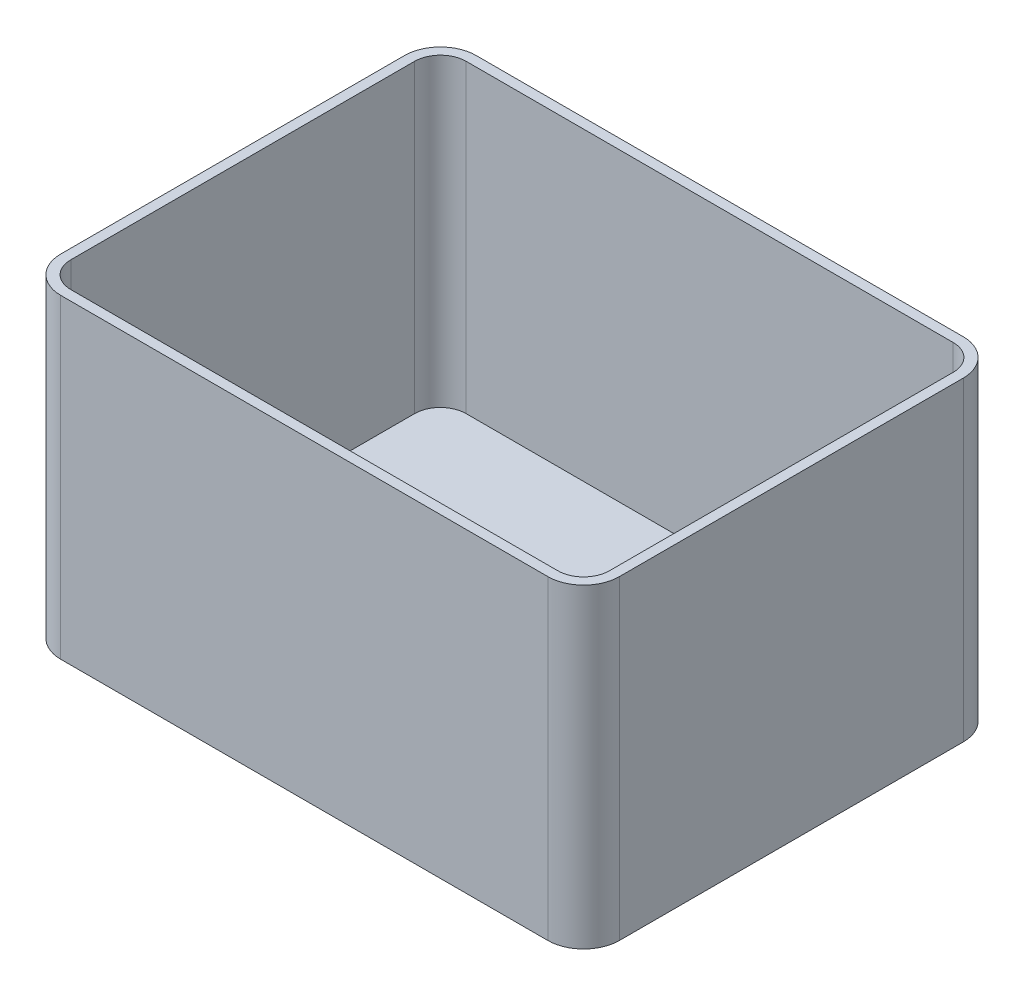
ISO-10303-21;
HEADER;
FILE_DESCRIPTION(('STEP AP214'),'2;1');
FILE_NAME('part.step','',(''),(''),'','','');
FILE_SCHEMA(('AUTOMOTIVE_DESIGN { 1 0 10303 214 1 1 1 1 }'));
ENDSEC;
DATA;
#1=APPLICATION_CONTEXT('core data for automotive mechanical design processes');
#2=APPLICATION_PROTOCOL_DEFINITION('international standard','automotive_design',2000,#1);
#3=PRODUCT_CONTEXT('',#1,'mechanical');
#4=PRODUCT('Part','Part','',(#3));
#5=PRODUCT_RELATED_PRODUCT_CATEGORY('part','',(#4));
#6=PRODUCT_DEFINITION_FORMATION('','',#4);
#7=PRODUCT_DEFINITION_CONTEXT('part definition',#1,'design');
#8=PRODUCT_DEFINITION('design','',#6,#7);
#9=PRODUCT_DEFINITION_SHAPE('','',#8);
#10=(LENGTH_UNIT() NAMED_UNIT(*) SI_UNIT(.MILLI.,.METRE.));
#11=(NAMED_UNIT(*) PLANE_ANGLE_UNIT() SI_UNIT($,.RADIAN.));
#12=(NAMED_UNIT(*) SI_UNIT($,.STERADIAN.) SOLID_ANGLE_UNIT());
#13=UNCERTAINTY_MEASURE_WITH_UNIT(LENGTH_MEASURE(1.E-05),#10,'distance_accuracy_value','');
#14=(GEOMETRIC_REPRESENTATION_CONTEXT(3) GLOBAL_UNCERTAINTY_ASSIGNED_CONTEXT((#13)) GLOBAL_UNIT_ASSIGNED_CONTEXT((#10,
#11,#12)) REPRESENTATION_CONTEXT('',''));
#15=CARTESIAN_POINT('',(0.,0.,0.));
#16=DIRECTION('',(0.,0.,1.));
#17=DIRECTION('',(1.,0.,0.));
#18=AXIS2_PLACEMENT_3D('',#15,#16,#17);
#19=CARTESIAN_POINT('',(170.,220.,-120.));
#20=DIRECTION('',(0.,-1.,0.));
#21=DIRECTION('',(0.,0.,-1.));
#22=AXIS2_PLACEMENT_3D('',#19,#20,#21);
#23=PLANE('',#22);
#24=CARTESIAN_POINT('',(170.,220.,-120.));
#25=DIRECTION('',(0.,1.,0.));
#26=DIRECTION('',(0.,0.,-1.));
#27=AXIS2_PLACEMENT_3D('',#24,#25,#26);
#28=CIRCLE('',#27,25.);
#29=CARTESIAN_POINT('',(195.,220.,-120.));
#30=VERTEX_POINT('',#29);
#31=CARTESIAN_POINT('',(170.,220.,-145.));
#32=VERTEX_POINT('',#31);
#33=EDGE_CURVE('E161',#30,#32,#28,.T.);
#34=ORIENTED_EDGE('',*,*,#33,.T.);
#35=DIRECTION('',(-1.,0.,0.));
#36=VECTOR('',#35,1.);
#37=CARTESIAN_POINT('',(-170.,220.,-145.));
#38=LINE('',#37,#36);
#39=CARTESIAN_POINT('',(-170.,220.,-145.));
#40=VERTEX_POINT('',#39);
#41=EDGE_CURVE('E102',#32,#40,#38,.T.);
#42=ORIENTED_EDGE('',*,*,#41,.T.);
#43=CARTESIAN_POINT('',(-170.,220.,-120.));
#44=DIRECTION('',(0.,1.,0.));
#45=DIRECTION('',(0.,0.,-1.));
#46=AXIS2_PLACEMENT_3D('',#43,#44,#45);
#47=CIRCLE('',#46,25.);
#48=CARTESIAN_POINT('',(-195.,220.,-120.));
#49=VERTEX_POINT('',#48);
#50=EDGE_CURVE('E176',#40,#49,#47,.T.);
#51=ORIENTED_EDGE('',*,*,#50,.T.);
#52=DIRECTION('',(0.,0.,1.));
#53=VECTOR('',#52,1.);
#54=CARTESIAN_POINT('',(-195.,220.,120.));
#55=LINE('',#54,#53);
#56=CARTESIAN_POINT('',(-195.,220.,120.));
#57=VERTEX_POINT('',#56);
#58=EDGE_CURVE('E188',#49,#57,#55,.T.);
#59=ORIENTED_EDGE('',*,*,#58,.T.);
#60=CARTESIAN_POINT('',(-170.,220.,120.));
#61=DIRECTION('',(0.,1.,0.));
#62=DIRECTION('',(0.,0.,-1.));
#63=AXIS2_PLACEMENT_3D('',#60,#61,#62);
#64=CIRCLE('',#63,25.);
#65=CARTESIAN_POINT('',(-170.,220.,145.));
#66=VERTEX_POINT('',#65);
#67=EDGE_CURVE('E124',#57,#66,#64,.T.);
#68=ORIENTED_EDGE('',*,*,#67,.T.);
#69=DIRECTION('',(1.,0.,0.));
#70=VECTOR('',#69,1.);
#71=CARTESIAN_POINT('',(-170.,220.,145.));
#72=LINE('',#71,#70);
#73=CARTESIAN_POINT('',(170.,220.,145.));
#74=VERTEX_POINT('',#73);
#75=EDGE_CURVE('E117',#66,#74,#72,.T.);
#76=ORIENTED_EDGE('',*,*,#75,.T.);
#77=CARTESIAN_POINT('',(170.,220.,120.));
#78=DIRECTION('',(0.,1.,0.));
#79=DIRECTION('',(0.,0.,1.));
#80=AXIS2_PLACEMENT_3D('',#77,#78,#79);
#81=CIRCLE('',#80,25.);
#82=CARTESIAN_POINT('',(195.,220.,120.));
#83=VERTEX_POINT('',#82);
#84=EDGE_CURVE('E121',#74,#83,#81,.T.);
#85=ORIENTED_EDGE('',*,*,#84,.T.);
#86=DIRECTION('',(0.,0.,-1.));
#87=VECTOR('',#86,1.);
#88=CARTESIAN_POINT('',(195.,220.,120.));
#89=LINE('',#88,#87);
#90=EDGE_CURVE('E61',#83,#30,#89,.T.);
#91=ORIENTED_EDGE('',*,*,#90,.T.);
#92=EDGE_LOOP('',(#34,#42,#51,#59,#68,#76,#85,#91));
#93=FACE_BOUND('',#92,.T.);
#94=CARTESIAN_POINT('',(170.,220.,-120.));
#95=DIRECTION('',(0.,-1.,0.));
#96=DIRECTION('',(0.,0.,-1.));
#97=AXIS2_PLACEMENT_3D('',#94,#95,#96);
#98=CIRCLE('',#97,18.);
#99=CARTESIAN_POINT('',(188.,220.,-120.));
#100=VERTEX_POINT('',#99);
#101=CARTESIAN_POINT('',(170.,220.,-138.));
#102=VERTEX_POINT('',#101);
#103=EDGE_CURVE('E214',#100,#102,#98,.F.);
#104=ORIENTED_EDGE('',*,*,#103,.F.);
#105=DIRECTION('',(0.,0.,-1.));
#106=VECTOR('',#105,1.);
#107=CARTESIAN_POINT('',(188.,220.,-120.));
#108=LINE('',#107,#106);
#109=CARTESIAN_POINT('',(188.,220.,120.));
#110=VERTEX_POINT('',#109);
#111=EDGE_CURVE('E194',#110,#100,#108,.T.);
#112=ORIENTED_EDGE('',*,*,#111,.F.);
#113=CARTESIAN_POINT('',(170.,220.,120.));
#114=DIRECTION('',(0.,-1.,0.));
#115=DIRECTION('',(0.,0.,-1.));
#116=AXIS2_PLACEMENT_3D('',#113,#114,#115);
#117=CIRCLE('',#116,18.);
#118=CARTESIAN_POINT('',(170.,220.,138.));
#119=VERTEX_POINT('',#118);
#120=EDGE_CURVE('E197',#119,#110,#117,.F.);
#121=ORIENTED_EDGE('',*,*,#120,.F.);
#122=DIRECTION('',(1.,0.,0.));
#123=VECTOR('',#122,1.);
#124=CARTESIAN_POINT('',(170.,220.,138.));
#125=LINE('',#124,#123);
#126=CARTESIAN_POINT('',(-170.,220.,138.));
#127=VERTEX_POINT('',#126);
#128=EDGE_CURVE('E199',#127,#119,#125,.T.);
#129=ORIENTED_EDGE('',*,*,#128,.F.);
#130=CARTESIAN_POINT('',(-170.,220.,120.));
#131=DIRECTION('',(0.,-1.,0.));
#132=DIRECTION('',(0.,0.,-1.));
#133=AXIS2_PLACEMENT_3D('',#130,#131,#132);
#134=CIRCLE('',#133,18.);
#135=CARTESIAN_POINT('',(-188.,220.,120.));
#136=VERTEX_POINT('',#135);
#137=EDGE_CURVE('E202',#136,#127,#134,.F.);
#138=ORIENTED_EDGE('',*,*,#137,.F.);
#139=DIRECTION('',(0.,0.,1.));
#140=VECTOR('',#139,1.);
#141=CARTESIAN_POINT('',(-188.,220.,-120.));
#142=LINE('',#141,#140);
#143=CARTESIAN_POINT('',(-188.,220.,-120.));
#144=VERTEX_POINT('',#143);
#145=EDGE_CURVE('E205',#144,#136,#142,.T.);
#146=ORIENTED_EDGE('',*,*,#145,.F.);
#147=CARTESIAN_POINT('',(-170.,220.,-120.));
#148=DIRECTION('',(0.,-1.,0.));
#149=DIRECTION('',(0.,0.,-1.));
#150=AXIS2_PLACEMENT_3D('',#147,#148,#149);
#151=CIRCLE('',#150,18.);
#152=CARTESIAN_POINT('',(-170.,220.,-138.));
#153=VERTEX_POINT('',#152);
#154=EDGE_CURVE('E208',#153,#144,#151,.F.);
#155=ORIENTED_EDGE('',*,*,#154,.F.);
#156=DIRECTION('',(-1.,0.,0.));
#157=VECTOR('',#156,1.);
#158=CARTESIAN_POINT('',(170.,220.,-138.));
#159=LINE('',#158,#157);
#160=EDGE_CURVE('E211',#102,#153,#159,.T.);
#161=ORIENTED_EDGE('',*,*,#160,.F.);
#162=EDGE_LOOP('',(#104,#112,#121,#129,#138,#146,#155,#161));
#163=FACE_BOUND('',#162,.T.);
#164=ADVANCED_FACE('F37',(#93,#163),#23,.F.);
#165=CARTESIAN_POINT('',(170.,220.,-120.));
#166=DIRECTION('',(0.,-1.,0.));
#167=DIRECTION('',(0.,0.,-1.));
#168=AXIS2_PLACEMENT_3D('',#165,#166,#167);
#169=CYLINDRICAL_SURFACE('',#168,25.);
#170=CARTESIAN_POINT('',(170.,0.,-120.));
#171=DIRECTION('',(0.,1.,0.));
#172=DIRECTION('',(0.,0.,-1.));
#173=AXIS2_PLACEMENT_3D('',#170,#171,#172);
#174=CIRCLE('',#173,25.);
#175=CARTESIAN_POINT('',(195.,0.,-120.));
#176=VERTEX_POINT('',#175);
#177=CARTESIAN_POINT('',(170.,0.,-145.));
#178=VERTEX_POINT('',#177);
#179=EDGE_CURVE('E145',#176,#178,#174,.T.);
#180=ORIENTED_EDGE('',*,*,#179,.T.);
#181=DIRECTION('',(0.,-1.,0.));
#182=VECTOR('',#181,1.);
#183=CARTESIAN_POINT('',(170.,220.,-145.));
#184=LINE('',#183,#182);
#185=EDGE_CURVE('E11',#32,#178,#184,.T.);
#186=ORIENTED_EDGE('',*,*,#185,.F.);
#187=ORIENTED_EDGE('',*,*,#33,.F.);
#188=DIRECTION('',(0.,-1.,0.));
#189=VECTOR('',#188,1.);
#190=CARTESIAN_POINT('',(195.,220.,-120.));
#191=LINE('',#190,#189);
#192=EDGE_CURVE('E141',#30,#176,#191,.T.);
#193=ORIENTED_EDGE('',*,*,#192,.T.);
#194=EDGE_LOOP('',(#180,#186,#187,#193));
#195=FACE_BOUND('',#194,.T.);
#196=ADVANCED_FACE('F39',(#195),#169,.T.);
#197=CARTESIAN_POINT('',(-170.,220.,-145.));
#198=DIRECTION('',(0.,0.,1.));
#199=DIRECTION('',(1.,0.,0.));
#200=AXIS2_PLACEMENT_3D('',#197,#198,#199);
#201=PLANE('',#200);
#202=DIRECTION('',(-1.,0.,0.));
#203=VECTOR('',#202,1.);
#204=CARTESIAN_POINT('',(-170.,0.,-145.));
#205=LINE('',#204,#203);
#206=CARTESIAN_POINT('',(-170.,0.,-145.));
#207=VERTEX_POINT('',#206);
#208=EDGE_CURVE('E148',#178,#207,#205,.T.);
#209=ORIENTED_EDGE('',*,*,#208,.T.);
#210=DIRECTION('',(0.,-1.,0.));
#211=VECTOR('',#210,1.);
#212=CARTESIAN_POINT('',(-170.,220.,-145.));
#213=LINE('',#212,#211);
#214=EDGE_CURVE('E45',#40,#207,#213,.T.);
#215=ORIENTED_EDGE('',*,*,#214,.F.);
#216=ORIENTED_EDGE('',*,*,#41,.F.);
#217=ORIENTED_EDGE('',*,*,#185,.T.);
#218=EDGE_LOOP('',(#209,#215,#216,#217));
#219=FACE_BOUND('',#218,.T.);
#220=ADVANCED_FACE('F333',(#219),#201,.F.);
#221=CARTESIAN_POINT('',(-170.,220.,-120.));
#222=DIRECTION('',(0.,-1.,0.));
#223=DIRECTION('',(0.,0.,-1.));
#224=AXIS2_PLACEMENT_3D('',#221,#222,#223);
#225=CYLINDRICAL_SURFACE('',#224,25.);
#226=CARTESIAN_POINT('',(-170.,0.,-120.));
#227=DIRECTION('',(0.,1.,0.));
#228=DIRECTION('',(0.,0.,-1.));
#229=AXIS2_PLACEMENT_3D('',#226,#227,#228);
#230=CIRCLE('',#229,25.);
#231=CARTESIAN_POINT('',(-195.,0.,-120.));
#232=VERTEX_POINT('',#231);
#233=EDGE_CURVE('E151',#207,#232,#230,.T.);
#234=ORIENTED_EDGE('',*,*,#233,.T.);
#235=DIRECTION('',(0.,-1.,0.));
#236=VECTOR('',#235,1.);
#237=CARTESIAN_POINT('',(-195.,220.,-120.));
#238=LINE('',#237,#236);
#239=EDGE_CURVE('E168',#49,#232,#238,.T.);
#240=ORIENTED_EDGE('',*,*,#239,.F.);
#241=ORIENTED_EDGE('',*,*,#50,.F.);
#242=ORIENTED_EDGE('',*,*,#214,.T.);
#243=EDGE_LOOP('',(#234,#240,#241,#242));
#244=FACE_BOUND('',#243,.T.);
#245=ADVANCED_FACE('F174',(#244),#225,.T.);
#246=CARTESIAN_POINT('',(-195.,220.,120.));
#247=DIRECTION('',(1.,0.,0.));
#248=DIRECTION('',(0.,0.,-1.));
#249=AXIS2_PLACEMENT_3D('',#246,#247,#248);
#250=PLANE('',#249);
#251=DIRECTION('',(0.,0.,1.));
#252=VECTOR('',#251,1.);
#253=CARTESIAN_POINT('',(-195.,0.,120.));
#254=LINE('',#253,#252);
#255=CARTESIAN_POINT('',(-195.,0.,120.));
#256=VERTEX_POINT('',#255);
#257=EDGE_CURVE('E153',#232,#256,#254,.T.);
#258=ORIENTED_EDGE('',*,*,#257,.T.);
#259=DIRECTION('',(0.,-1.,0.));
#260=VECTOR('',#259,1.);
#261=CARTESIAN_POINT('',(-195.,220.,120.));
#262=LINE('',#261,#260);
#263=EDGE_CURVE('E165',#57,#256,#262,.T.);
#264=ORIENTED_EDGE('',*,*,#263,.F.);
#265=ORIENTED_EDGE('',*,*,#58,.F.);
#266=ORIENTED_EDGE('',*,*,#239,.T.);
#267=EDGE_LOOP('',(#258,#264,#265,#266));
#268=FACE_BOUND('',#267,.T.);
#269=ADVANCED_FACE('F184',(#268),#250,.F.);
#270=CARTESIAN_POINT('',(-170.,220.,120.));
#271=DIRECTION('',(0.,-1.,0.));
#272=DIRECTION('',(0.,0.,-1.));
#273=AXIS2_PLACEMENT_3D('',#270,#271,#272);
#274=CYLINDRICAL_SURFACE('',#273,25.);
#275=CARTESIAN_POINT('',(-170.,0.,120.));
#276=DIRECTION('',(0.,1.,0.));
#277=DIRECTION('',(0.,0.,-1.));
#278=AXIS2_PLACEMENT_3D('',#275,#276,#277);
#279=CIRCLE('',#278,25.);
#280=CARTESIAN_POINT('',(-170.,0.,145.));
#281=VERTEX_POINT('',#280);
#282=EDGE_CURVE('E155',#256,#281,#279,.T.);
#283=ORIENTED_EDGE('',*,*,#282,.T.);
#284=DIRECTION('',(0.,-1.,0.));
#285=VECTOR('',#284,1.);
#286=CARTESIAN_POINT('',(-170.,220.,145.));
#287=LINE('',#286,#285);
#288=EDGE_CURVE('E136',#66,#281,#287,.T.);
#289=ORIENTED_EDGE('',*,*,#288,.F.);
#290=ORIENTED_EDGE('',*,*,#67,.F.);
#291=ORIENTED_EDGE('',*,*,#263,.T.);
#292=EDGE_LOOP('',(#283,#289,#290,#291));
#293=FACE_BOUND('',#292,.T.);
#294=ADVANCED_FACE('F187',(#293),#274,.T.);
#295=CARTESIAN_POINT('',(-170.,220.,145.));
#296=DIRECTION('',(0.,0.,-1.));
#297=DIRECTION('',(-1.,0.,0.));
#298=AXIS2_PLACEMENT_3D('',#295,#296,#297);
#299=PLANE('',#298);
#300=DIRECTION('',(1.,0.,0.));
#301=VECTOR('',#300,1.);
#302=CARTESIAN_POINT('',(-170.,0.,145.));
#303=LINE('',#302,#301);
#304=CARTESIAN_POINT('',(170.,0.,145.));
#305=VERTEX_POINT('',#304);
#306=EDGE_CURVE('E133',#281,#305,#303,.T.);
#307=ORIENTED_EDGE('',*,*,#306,.T.);
#308=DIRECTION('',(0.,-1.,0.));
#309=VECTOR('',#308,1.);
#310=CARTESIAN_POINT('',(170.,220.,145.));
#311=LINE('',#310,#309);
#312=EDGE_CURVE('E130',#74,#305,#311,.T.);
#313=ORIENTED_EDGE('',*,*,#312,.F.);
#314=ORIENTED_EDGE('',*,*,#75,.F.);
#315=ORIENTED_EDGE('',*,*,#288,.T.);
#316=EDGE_LOOP('',(#307,#313,#314,#315));
#317=FACE_BOUND('',#316,.T.);
#318=ADVANCED_FACE('F131',(#317),#299,.F.);
#319=CARTESIAN_POINT('',(170.,220.,120.));
#320=DIRECTION('',(0.,-1.,0.));
#321=DIRECTION('',(0.,0.,-1.));
#322=AXIS2_PLACEMENT_3D('',#319,#320,#321);
#323=CYLINDRICAL_SURFACE('',#322,25.);
#324=CARTESIAN_POINT('',(170.,0.,120.));
#325=DIRECTION('',(0.,1.,0.));
#326=DIRECTION('',(0.,0.,1.));
#327=AXIS2_PLACEMENT_3D('',#324,#325,#326);
#328=CIRCLE('',#327,25.);
#329=CARTESIAN_POINT('',(195.,0.,120.));
#330=VERTEX_POINT('',#329);
#331=EDGE_CURVE('E158',#305,#330,#328,.T.);
#332=ORIENTED_EDGE('',*,*,#331,.T.);
#333=DIRECTION('',(0.,-1.,0.));
#334=VECTOR('',#333,1.);
#335=CARTESIAN_POINT('',(195.,220.,120.));
#336=LINE('',#335,#334);
#337=EDGE_CURVE('E137',#83,#330,#336,.T.);
#338=ORIENTED_EDGE('',*,*,#337,.F.);
#339=ORIENTED_EDGE('',*,*,#84,.F.);
#340=ORIENTED_EDGE('',*,*,#312,.T.);
#341=EDGE_LOOP('',(#332,#338,#339,#340));
#342=FACE_BOUND('',#341,.T.);
#343=ADVANCED_FACE('F139',(#342),#323,.T.);
#344=CARTESIAN_POINT('',(195.,220.,120.));
#345=DIRECTION('',(-1.,0.,0.));
#346=DIRECTION('',(0.,0.,1.));
#347=AXIS2_PLACEMENT_3D('',#344,#345,#346);
#348=PLANE('',#347);
#349=DIRECTION('',(0.,0.,-1.));
#350=VECTOR('',#349,1.);
#351=CARTESIAN_POINT('',(195.,0.,120.));
#352=LINE('',#351,#350);
#353=EDGE_CURVE('E94',#330,#176,#352,.T.);
#354=ORIENTED_EDGE('',*,*,#353,.T.);
#355=ORIENTED_EDGE('',*,*,#192,.F.);
#356=ORIENTED_EDGE('',*,*,#90,.F.);
#357=ORIENTED_EDGE('',*,*,#337,.T.);
#358=EDGE_LOOP('',(#354,#355,#356,#357));
#359=FACE_BOUND('',#358,.T.);
#360=ADVANCED_FACE('F339',(#359),#348,.F.);
#361=CARTESIAN_POINT('',(170.,0.,-120.));
#362=DIRECTION('',(0.,-1.,0.));
#363=DIRECTION('',(0.,0.,-1.));
#364=AXIS2_PLACEMENT_3D('',#361,#362,#363);
#365=PLANE('',#364);
#366=ORIENTED_EDGE('',*,*,#179,.F.);
#367=ORIENTED_EDGE('',*,*,#353,.F.);
#368=ORIENTED_EDGE('',*,*,#331,.F.);
#369=ORIENTED_EDGE('',*,*,#306,.F.);
#370=ORIENTED_EDGE('',*,*,#282,.F.);
#371=ORIENTED_EDGE('',*,*,#257,.F.);
#372=ORIENTED_EDGE('',*,*,#233,.F.);
#373=ORIENTED_EDGE('',*,*,#208,.F.);
#374=EDGE_LOOP('',(#366,#367,#368,#369,#370,#371,#372,#373));
#375=FACE_BOUND('',#374,.T.);
#376=ADVANCED_FACE('F180',(#375),#365,.T.);
#377=CARTESIAN_POINT('',(170.,220.,-120.));
#378=DIRECTION('',(0.,-1.,0.));
#379=DIRECTION('',(0.,0.,-1.));
#380=AXIS2_PLACEMENT_3D('',#377,#378,#379);
#381=CYLINDRICAL_SURFACE('',#380,18.);
#382=CARTESIAN_POINT('',(170.,7.00000000000001,-120.));
#383=DIRECTION('',(0.,-1.,0.));
#384=DIRECTION('',(0.,0.,-1.));
#385=AXIS2_PLACEMENT_3D('',#382,#383,#384);
#386=CIRCLE('',#385,18.);
#387=CARTESIAN_POINT('',(188.,7.00000000000001,-120.));
#388=VERTEX_POINT('',#387);
#389=CARTESIAN_POINT('',(170.,7.00000000000001,-138.));
#390=VERTEX_POINT('',#389);
#391=EDGE_CURVE('E254',#388,#390,#386,.F.);
#392=ORIENTED_EDGE('',*,*,#391,.F.);
#393=DIRECTION('',(0.,-1.,0.));
#394=VECTOR('',#393,1.);
#395=CARTESIAN_POINT('',(188.,220.,-120.));
#396=LINE('',#395,#394);
#397=EDGE_CURVE('E196',#100,#388,#396,.T.);
#398=ORIENTED_EDGE('',*,*,#397,.F.);
#399=ORIENTED_EDGE('',*,*,#103,.T.);
#400=DIRECTION('',(0.,1.,0.));
#401=VECTOR('',#400,1.);
#402=CARTESIAN_POINT('',(170.,220.,-138.));
#403=LINE('',#402,#401);
#404=EDGE_CURVE('E149',#102,#390,#403,.F.);
#405=ORIENTED_EDGE('',*,*,#404,.T.);
#406=EDGE_LOOP('',(#392,#398,#399,#405));
#407=FACE_BOUND('',#406,.T.);
#408=ADVANCED_FACE('F270',(#407),#381,.F.);
#409=CARTESIAN_POINT('',(-170.,220.,-138.));
#410=DIRECTION('',(0.,0.,1.));
#411=DIRECTION('',(1.,0.,0.));
#412=AXIS2_PLACEMENT_3D('',#409,#410,#411);
#413=PLANE('',#412);
#414=DIRECTION('',(-1.,0.,0.));
#415=VECTOR('',#414,1.);
#416=CARTESIAN_POINT('',(170.,7.,-138.));
#417=LINE('',#416,#415);
#418=CARTESIAN_POINT('',(-170.,7.00000000000001,-138.));
#419=VERTEX_POINT('',#418);
#420=EDGE_CURVE('E249',#390,#419,#417,.T.);
#421=ORIENTED_EDGE('',*,*,#420,.F.);
#422=ORIENTED_EDGE('',*,*,#404,.F.);
#423=ORIENTED_EDGE('',*,*,#160,.T.);
#424=DIRECTION('',(0.,-1.,0.));
#425=VECTOR('',#424,1.);
#426=CARTESIAN_POINT('',(-170.,220.,-138.));
#427=LINE('',#426,#425);
#428=EDGE_CURVE('E246',#153,#419,#427,.T.);
#429=ORIENTED_EDGE('',*,*,#428,.T.);
#430=EDGE_LOOP('',(#421,#422,#423,#429));
#431=FACE_BOUND('',#430,.T.);
#432=ADVANCED_FACE('F299',(#431),#413,.T.);
#433=CARTESIAN_POINT('',(-170.,220.,-120.));
#434=DIRECTION('',(0.,-1.,0.));
#435=DIRECTION('',(0.,0.,-1.));
#436=AXIS2_PLACEMENT_3D('',#433,#434,#435);
#437=CYLINDRICAL_SURFACE('',#436,18.);
#438=CARTESIAN_POINT('',(-170.,7.00000000000001,-120.));
#439=DIRECTION('',(0.,-1.,0.));
#440=DIRECTION('',(0.,0.,-1.));
#441=AXIS2_PLACEMENT_3D('',#438,#439,#440);
#442=CIRCLE('',#441,18.);
#443=CARTESIAN_POINT('',(-188.,7.00000000000001,-120.));
#444=VERTEX_POINT('',#443);
#445=EDGE_CURVE('E243',#419,#444,#442,.F.);
#446=ORIENTED_EDGE('',*,*,#445,.F.);
#447=ORIENTED_EDGE('',*,*,#428,.F.);
#448=ORIENTED_EDGE('',*,*,#154,.T.);
#449=DIRECTION('',(0.,1.,0.));
#450=VECTOR('',#449,1.);
#451=CARTESIAN_POINT('',(-188.,220.,-120.));
#452=LINE('',#451,#450);
#453=EDGE_CURVE('E240',#144,#444,#452,.F.);
#454=ORIENTED_EDGE('',*,*,#453,.T.);
#455=EDGE_LOOP('',(#446,#447,#448,#454));
#456=FACE_BOUND('',#455,.T.);
#457=ADVANCED_FACE('F305',(#456),#437,.F.);
#458=CARTESIAN_POINT('',(-188.,220.,120.));
#459=DIRECTION('',(1.,0.,0.));
#460=DIRECTION('',(0.,0.,-1.));
#461=AXIS2_PLACEMENT_3D('',#458,#459,#460);
#462=PLANE('',#461);
#463=DIRECTION('',(0.,0.,1.));
#464=VECTOR('',#463,1.);
#465=CARTESIAN_POINT('',(-188.,7.,-120.));
#466=LINE('',#465,#464);
#467=CARTESIAN_POINT('',(-188.,7.00000000000001,120.));
#468=VERTEX_POINT('',#467);
#469=EDGE_CURVE('E237',#444,#468,#466,.T.);
#470=ORIENTED_EDGE('',*,*,#469,.F.);
#471=ORIENTED_EDGE('',*,*,#453,.F.);
#472=ORIENTED_EDGE('',*,*,#145,.T.);
#473=DIRECTION('',(0.,-1.,0.));
#474=VECTOR('',#473,1.);
#475=CARTESIAN_POINT('',(-188.,220.,120.));
#476=LINE('',#475,#474);
#477=EDGE_CURVE('E234',#136,#468,#476,.T.);
#478=ORIENTED_EDGE('',*,*,#477,.T.);
#479=EDGE_LOOP('',(#470,#471,#472,#478));
#480=FACE_BOUND('',#479,.T.);
#481=ADVANCED_FACE('F404',(#480),#462,.T.);
#482=CARTESIAN_POINT('',(-170.,220.,120.));
#483=DIRECTION('',(0.,-1.,0.));
#484=DIRECTION('',(0.,0.,-1.));
#485=AXIS2_PLACEMENT_3D('',#482,#483,#484);
#486=CYLINDRICAL_SURFACE('',#485,18.);
#487=CARTESIAN_POINT('',(-170.,7.00000000000001,120.));
#488=DIRECTION('',(0.,-1.,0.));
#489=DIRECTION('',(0.,0.,-1.));
#490=AXIS2_PLACEMENT_3D('',#487,#488,#489);
#491=CIRCLE('',#490,18.);
#492=CARTESIAN_POINT('',(-170.,7.00000000000001,138.));
#493=VERTEX_POINT('',#492);
#494=EDGE_CURVE('E231',#468,#493,#491,.F.);
#495=ORIENTED_EDGE('',*,*,#494,.F.);
#496=ORIENTED_EDGE('',*,*,#477,.F.);
#497=ORIENTED_EDGE('',*,*,#137,.T.);
#498=DIRECTION('',(0.,1.,0.));
#499=VECTOR('',#498,1.);
#500=CARTESIAN_POINT('',(-170.,220.,138.));
#501=LINE('',#500,#499);
#502=EDGE_CURVE('E228',#127,#493,#501,.F.);
#503=ORIENTED_EDGE('',*,*,#502,.T.);
#504=EDGE_LOOP('',(#495,#496,#497,#503));
#505=FACE_BOUND('',#504,.T.);
#506=ADVANCED_FACE('F326',(#505),#486,.F.);
#507=CARTESIAN_POINT('',(-170.,220.,138.));
#508=DIRECTION('',(0.,0.,-1.));
#509=DIRECTION('',(-1.,0.,0.));
#510=AXIS2_PLACEMENT_3D('',#507,#508,#509);
#511=PLANE('',#510);
#512=DIRECTION('',(1.,0.,0.));
#513=VECTOR('',#512,1.);
#514=CARTESIAN_POINT('',(170.,7.,138.));
#515=LINE('',#514,#513);
#516=CARTESIAN_POINT('',(170.,7.00000000000001,138.));
#517=VERTEX_POINT('',#516);
#518=EDGE_CURVE('E225',#493,#517,#515,.T.);
#519=ORIENTED_EDGE('',*,*,#518,.F.);
#520=ORIENTED_EDGE('',*,*,#502,.F.);
#521=ORIENTED_EDGE('',*,*,#128,.T.);
#522=DIRECTION('',(0.,-1.,0.));
#523=VECTOR('',#522,1.);
#524=CARTESIAN_POINT('',(170.,220.,138.));
#525=LINE('',#524,#523);
#526=EDGE_CURVE('E222',#119,#517,#525,.T.);
#527=ORIENTED_EDGE('',*,*,#526,.T.);
#528=EDGE_LOOP('',(#519,#520,#521,#527));
#529=FACE_BOUND('',#528,.T.);
#530=ADVANCED_FACE('F316',(#529),#511,.T.);
#531=CARTESIAN_POINT('',(170.,220.,120.));
#532=DIRECTION('',(0.,-1.,0.));
#533=DIRECTION('',(0.,0.,-1.));
#534=AXIS2_PLACEMENT_3D('',#531,#532,#533);
#535=CYLINDRICAL_SURFACE('',#534,18.);
#536=CARTESIAN_POINT('',(170.,7.00000000000001,120.));
#537=DIRECTION('',(0.,-1.,0.));
#538=DIRECTION('',(0.,0.,-1.));
#539=AXIS2_PLACEMENT_3D('',#536,#537,#538);
#540=CIRCLE('',#539,18.);
#541=CARTESIAN_POINT('',(188.,7.00000000000001,120.));
#542=VERTEX_POINT('',#541);
#543=EDGE_CURVE('E220',#517,#542,#540,.F.);
#544=ORIENTED_EDGE('',*,*,#543,.F.);
#545=ORIENTED_EDGE('',*,*,#526,.F.);
#546=ORIENTED_EDGE('',*,*,#120,.T.);
#547=DIRECTION('',(0.,1.,0.));
#548=VECTOR('',#547,1.);
#549=CARTESIAN_POINT('',(188.,220.,120.));
#550=LINE('',#549,#548);
#551=EDGE_CURVE('E52',#110,#542,#550,.F.);
#552=ORIENTED_EDGE('',*,*,#551,.T.);
#553=EDGE_LOOP('',(#544,#545,#546,#552));
#554=FACE_BOUND('',#553,.T.);
#555=ADVANCED_FACE('F318',(#554),#535,.F.);
#556=CARTESIAN_POINT('',(188.,220.,120.));
#557=DIRECTION('',(-1.,0.,0.));
#558=DIRECTION('',(0.,0.,1.));
#559=AXIS2_PLACEMENT_3D('',#556,#557,#558);
#560=PLANE('',#559);
#561=DIRECTION('',(0.,0.,-1.));
#562=VECTOR('',#561,1.);
#563=CARTESIAN_POINT('',(188.,7.,-120.));
#564=LINE('',#563,#562);
#565=EDGE_CURVE('E217',#542,#388,#564,.T.);
#566=ORIENTED_EDGE('',*,*,#565,.F.);
#567=ORIENTED_EDGE('',*,*,#551,.F.);
#568=ORIENTED_EDGE('',*,*,#111,.T.);
#569=ORIENTED_EDGE('',*,*,#397,.T.);
#570=EDGE_LOOP('',(#566,#567,#568,#569));
#571=FACE_BOUND('',#570,.T.);
#572=ADVANCED_FACE('F294',(#571),#560,.T.);
#573=CARTESIAN_POINT('',(170.,7.,-120.));
#574=DIRECTION('',(0.,-1.,0.));
#575=DIRECTION('',(0.,0.,-1.));
#576=AXIS2_PLACEMENT_3D('',#573,#574,#575);
#577=PLANE('',#576);
#578=ORIENTED_EDGE('',*,*,#391,.T.);
#579=ORIENTED_EDGE('',*,*,#420,.T.);
#580=ORIENTED_EDGE('',*,*,#445,.T.);
#581=ORIENTED_EDGE('',*,*,#469,.T.);
#582=ORIENTED_EDGE('',*,*,#494,.T.);
#583=ORIENTED_EDGE('',*,*,#518,.T.);
#584=ORIENTED_EDGE('',*,*,#543,.T.);
#585=ORIENTED_EDGE('',*,*,#565,.T.);
#586=EDGE_LOOP('',(#578,#579,#580,#581,#582,#583,#584,#585));
#587=FACE_BOUND('',#586,.T.);
#588=ADVANCED_FACE('F263',(#587),#577,.F.);
#589=CLOSED_SHELL('',(#164,#196,#220,#245,#269,#294,#318,#343,#360,#376,#408,#432,#457,#481,
#506,#530,#555,#572,#588));
#590=MANIFOLD_SOLID_BREP('B2',#589);
#591=ADVANCED_BREP_SHAPE_REPRESENTATION('',(#18,#590),#14);
#592=SHAPE_DEFINITION_REPRESENTATION(#9,#591);
ENDSEC;
END-ISO-10303-21;
